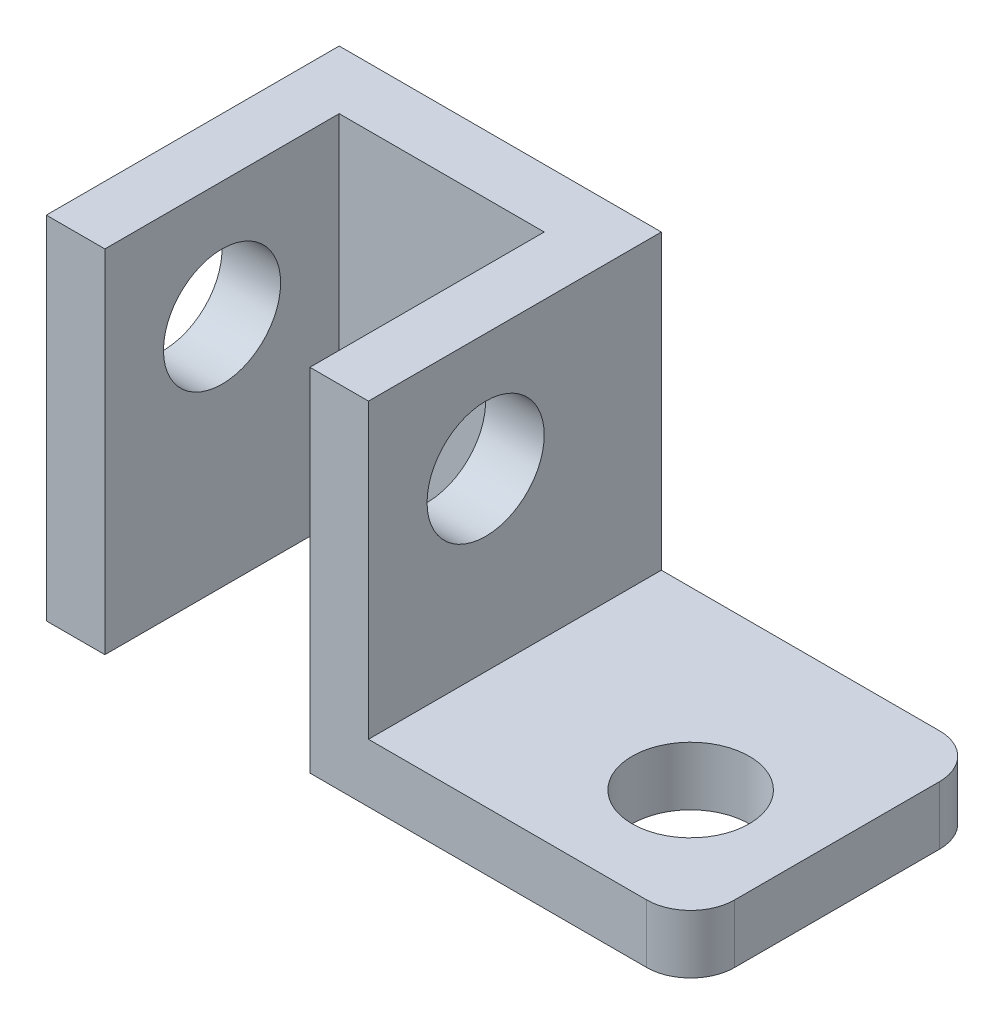
ISO-10303-21;
HEADER;
FILE_DESCRIPTION(('STEP AP214'),'2;1');
FILE_NAME('part.step','',(''),(''),'','','');
FILE_SCHEMA(('AUTOMOTIVE_DESIGN { 1 0 10303 214 1 1 1 1 }'));
ENDSEC;
DATA;
#1=APPLICATION_CONTEXT('core data for automotive mechanical design processes');
#2=APPLICATION_PROTOCOL_DEFINITION('international standard','automotive_design',2000,#1);
#3=PRODUCT_CONTEXT('',#1,'mechanical');
#4=PRODUCT('Part','Part','',(#3));
#5=PRODUCT_RELATED_PRODUCT_CATEGORY('part','',(#4));
#6=PRODUCT_DEFINITION_FORMATION('','',#4);
#7=PRODUCT_DEFINITION_CONTEXT('part definition',#1,'design');
#8=PRODUCT_DEFINITION('design','',#6,#7);
#9=PRODUCT_DEFINITION_SHAPE('','',#8);
#10=(LENGTH_UNIT() NAMED_UNIT(*) SI_UNIT(.MILLI.,.METRE.));
#11=(NAMED_UNIT(*) PLANE_ANGLE_UNIT() SI_UNIT($,.RADIAN.));
#12=(NAMED_UNIT(*) SI_UNIT($,.STERADIAN.) SOLID_ANGLE_UNIT());
#13=UNCERTAINTY_MEASURE_WITH_UNIT(LENGTH_MEASURE(1.E-05),#10,'distance_accuracy_value','');
#14=(GEOMETRIC_REPRESENTATION_CONTEXT(3) GLOBAL_UNCERTAINTY_ASSIGNED_CONTEXT((#13)) GLOBAL_UNIT_ASSIGNED_CONTEXT((#10,
#11,#12)) REPRESENTATION_CONTEXT('',''));
#15=CARTESIAN_POINT('',(0.,0.,0.));
#16=DIRECTION('',(0.,0.,1.));
#17=DIRECTION('',(1.,0.,0.));
#18=AXIS2_PLACEMENT_3D('',#15,#16,#17);
#19=CARTESIAN_POINT('',(0.,120.,-80.));
#20=DIRECTION('',(1.,0.,0.));
#21=DIRECTION('',(0.,0.,-1.));
#22=AXIS2_PLACEMENT_3D('',#19,#20,#21);
#23=PLANE('',#22);
#24=CARTESIAN_POINT('',(0.,80.,-40.));
#25=DIRECTION('',(1.,0.,0.));
#26=DIRECTION('',(0.,0.,-1.));
#27=AXIS2_PLACEMENT_3D('',#24,#25,#26);
#28=CIRCLE('',#27,20.);
#29=CARTESIAN_POINT('',(0.,80.,-60.));
#30=VERTEX_POINT('',#29);
#31=EDGE_CURVE('E303',#30,#30,#28,.T.);
#32=ORIENTED_EDGE('',*,*,#31,.F.);
#33=EDGE_LOOP('',(#32));
#34=FACE_BOUND('',#33,.T.);
#35=DIRECTION('',(0.,-1.,0.));
#36=VECTOR('',#35,1.);
#37=CARTESIAN_POINT('',(0.,120.,0.));
#38=LINE('',#37,#36);
#39=CARTESIAN_POINT('',(0.,120.,0.));
#40=VERTEX_POINT('',#39);
#41=CARTESIAN_POINT('',(0.,0.,0.));
#42=VERTEX_POINT('',#41);
#43=EDGE_CURVE('E253',#40,#42,#38,.T.);
#44=ORIENTED_EDGE('',*,*,#43,.T.);
#45=DIRECTION('',(0.,0.,1.));
#46=VECTOR('',#45,1.);
#47=CARTESIAN_POINT('',(0.,0.,-80.));
#48=LINE('',#47,#46);
#49=CARTESIAN_POINT('',(0.,0.,-80.));
#50=VERTEX_POINT('',#49);
#51=EDGE_CURVE('E237',#50,#42,#48,.T.);
#52=ORIENTED_EDGE('',*,*,#51,.F.);
#53=DIRECTION('',(0.,-1.,0.));
#54=VECTOR('',#53,1.);
#55=CARTESIAN_POINT('',(0.,120.,-80.));
#56=LINE('',#55,#54);
#57=CARTESIAN_POINT('',(0.,120.,-80.));
#58=VERTEX_POINT('',#57);
#59=EDGE_CURVE('E12',#58,#50,#56,.T.);
#60=ORIENTED_EDGE('',*,*,#59,.F.);
#61=DIRECTION('',(0.,0.,1.));
#62=VECTOR('',#61,1.);
#63=CARTESIAN_POINT('',(0.,120.,-80.));
#64=LINE('',#63,#62);
#65=EDGE_CURVE('E255',#58,#40,#64,.T.);
#66=ORIENTED_EDGE('',*,*,#65,.T.);
#67=EDGE_LOOP('',(#44,#52,#60,#66));
#68=FACE_BOUND('',#67,.T.);
#69=ADVANCED_FACE('F173',(#34,#68),#23,.T.);
#70=CARTESIAN_POINT('',(0.,0.,0.));
#71=DIRECTION('',(0.,-1.,0.));
#72=DIRECTION('',(-1.,0.,0.));
#73=AXIS2_PLACEMENT_3D('',#70,#71,#72);
#74=PLANE('',#73);
#75=DIRECTION('',(1.,0.,0.));
#76=VECTOR('',#75,1.);
#77=CARTESIAN_POINT('',(-20.,0.,-100.));
#78=LINE('',#77,#76);
#79=CARTESIAN_POINT('',(-20.,0.,-100.));
#80=VERTEX_POINT('',#79);
#81=CARTESIAN_POINT('',(185.,0.,-100.));
#82=VERTEX_POINT('',#81);
#83=EDGE_CURVE('E270',#80,#82,#78,.T.);
#84=ORIENTED_EDGE('',*,*,#83,.T.);
#85=CARTESIAN_POINT('',(185.,0.,-85.));
#86=DIRECTION('',(0.,1.,0.));
#87=DIRECTION('',(0.,0.,1.));
#88=AXIS2_PLACEMENT_3D('',#85,#86,#87);
#89=CIRCLE('',#88,15.);
#90=CARTESIAN_POINT('',(200.,0.,-85.));
#91=VERTEX_POINT('',#90);
#92=EDGE_CURVE('E309',#91,#82,#89,.T.);
#93=ORIENTED_EDGE('',*,*,#92,.F.);
#94=DIRECTION('',(0.,0.,-1.));
#95=VECTOR('',#94,1.);
#96=CARTESIAN_POINT('',(200.,0.,0.));
#97=LINE('',#96,#95);
#98=CARTESIAN_POINT('',(200.,0.,-15.));
#99=VERTEX_POINT('',#98);
#100=EDGE_CURVE('E306',#99,#91,#97,.T.);
#101=ORIENTED_EDGE('',*,*,#100,.F.);
#102=CARTESIAN_POINT('',(185.,0.,-15.));
#103=DIRECTION('',(0.,1.,0.));
#104=DIRECTION('',(0.,0.,1.));
#105=AXIS2_PLACEMENT_3D('',#102,#103,#104);
#106=CIRCLE('',#105,15.);
#107=CARTESIAN_POINT('',(185.,0.,0.));
#108=VERTEX_POINT('',#107);
#109=EDGE_CURVE('E302',#108,#99,#106,.T.);
#110=ORIENTED_EDGE('',*,*,#109,.F.);
#111=DIRECTION('',(-1.,0.,0.));
#112=VECTOR('',#111,1.);
#113=CARTESIAN_POINT('',(90.,0.,0.));
#114=LINE('',#113,#112);
#115=CARTESIAN_POINT('',(70.,0.,0.));
#116=VERTEX_POINT('',#115);
#117=EDGE_CURVE('E325',#108,#116,#114,.T.);
#118=ORIENTED_EDGE('',*,*,#117,.T.);
#119=DIRECTION('',(0.,0.,-1.));
#120=VECTOR('',#119,1.);
#121=CARTESIAN_POINT('',(70.,0.,0.));
#122=LINE('',#121,#120);
#123=CARTESIAN_POINT('',(70.,0.,-80.));
#124=VERTEX_POINT('',#123);
#125=EDGE_CURVE('E336',#116,#124,#122,.T.);
#126=ORIENTED_EDGE('',*,*,#125,.T.);
#127=DIRECTION('',(-1.,0.,0.));
#128=VECTOR('',#127,1.);
#129=CARTESIAN_POINT('',(70.,0.,-80.));
#130=LINE('',#129,#128);
#131=EDGE_CURVE('E247',#124,#50,#130,.T.);
#132=ORIENTED_EDGE('',*,*,#131,.T.);
#133=ORIENTED_EDGE('',*,*,#51,.T.);
#134=DIRECTION('',(-1.,0.,0.));
#135=VECTOR('',#134,1.);
#136=CARTESIAN_POINT('',(0.,0.,0.));
#137=LINE('',#136,#135);
#138=CARTESIAN_POINT('',(-20.,0.,0.));
#139=VERTEX_POINT('',#138);
#140=EDGE_CURVE('E244',#42,#139,#137,.T.);
#141=ORIENTED_EDGE('',*,*,#140,.T.);
#142=DIRECTION('',(0.,0.,-1.));
#143=VECTOR('',#142,1.);
#144=CARTESIAN_POINT('',(-20.,0.,0.));
#145=LINE('',#144,#143);
#146=EDGE_CURVE('E265',#139,#80,#145,.T.);
#147=ORIENTED_EDGE('',*,*,#146,.T.);
#148=EDGE_LOOP('',(#84,#93,#101,#110,#118,#126,#132,#133,#141,#147));
#149=FACE_BOUND('',#148,.T.);
#150=CARTESIAN_POINT('',(160.,0.,-40.));
#151=DIRECTION('',(0.,1.,0.));
#152=DIRECTION('',(0.,0.,1.));
#153=AXIS2_PLACEMENT_3D('',#150,#151,#152);
#154=CIRCLE('',#153,20.);
#155=CARTESIAN_POINT('',(160.,0.,-20.));
#156=VERTEX_POINT('',#155);
#157=EDGE_CURVE('E299',#156,#156,#154,.T.);
#158=ORIENTED_EDGE('',*,*,#157,.T.);
#159=EDGE_LOOP('',(#158));
#160=FACE_BOUND('',#159,.T.);
#161=ADVANCED_FACE('F240',(#149,#160),#74,.T.);
#162=CARTESIAN_POINT('',(90.,120.,-10.));
#163=DIRECTION('',(1.,0.,0.));
#164=DIRECTION('',(0.,0.,-1.));
#165=AXIS2_PLACEMENT_3D('',#162,#163,#164);
#166=PLANE('',#165);
#167=CARTESIAN_POINT('',(90.,80.,-40.));
#168=DIRECTION('',(1.,0.,0.));
#169=DIRECTION('',(0.,0.,-1.));
#170=AXIS2_PLACEMENT_3D('',#167,#168,#169);
#171=CIRCLE('',#170,20.);
#172=CARTESIAN_POINT('',(90.,80.,-60.));
#173=VERTEX_POINT('',#172);
#174=EDGE_CURVE('E427',#173,#173,#171,.T.);
#175=ORIENTED_EDGE('',*,*,#174,.F.);
#176=EDGE_LOOP('',(#175));
#177=FACE_BOUND('',#176,.T.);
#178=DIRECTION('',(0.,0.,1.));
#179=VECTOR('',#178,1.);
#180=CARTESIAN_POINT('',(90.,20.,0.));
#181=LINE('',#180,#179);
#182=CARTESIAN_POINT('',(90.,20.,-100.));
#183=VERTEX_POINT('',#182);
#184=CARTESIAN_POINT('',(90.,20.,0.));
#185=VERTEX_POINT('',#184);
#186=EDGE_CURVE('E190',#183,#185,#181,.T.);
#187=ORIENTED_EDGE('',*,*,#186,.F.);
#188=DIRECTION('',(0.,-1.,0.));
#189=VECTOR('',#188,1.);
#190=CARTESIAN_POINT('',(90.,120.,-100.));
#191=LINE('',#190,#189);
#192=CARTESIAN_POINT('',(90.,120.,-100.));
#193=VERTEX_POINT('',#192);
#194=EDGE_CURVE('E250',#193,#183,#191,.T.);
#195=ORIENTED_EDGE('',*,*,#194,.F.);
#196=DIRECTION('',(0.,0.,1.));
#197=VECTOR('',#196,1.);
#198=CARTESIAN_POINT('',(90.,120.,-10.));
#199=LINE('',#198,#197);
#200=CARTESIAN_POINT('',(90.,120.,0.));
#201=VERTEX_POINT('',#200);
#202=EDGE_CURVE('E333',#193,#201,#199,.T.);
#203=ORIENTED_EDGE('',*,*,#202,.T.);
#204=DIRECTION('',(0.,-1.,0.));
#205=VECTOR('',#204,1.);
#206=CARTESIAN_POINT('',(90.,120.,0.));
#207=LINE('',#206,#205);
#208=EDGE_CURVE('E198',#201,#185,#207,.T.);
#209=ORIENTED_EDGE('',*,*,#208,.T.);
#210=EDGE_LOOP('',(#187,#195,#203,#209));
#211=FACE_BOUND('',#210,.T.);
#212=ADVANCED_FACE('F388',(#177,#211),#166,.T.);
#213=CARTESIAN_POINT('',(0.,120.,0.));
#214=DIRECTION('',(0.,-1.,0.));
#215=DIRECTION('',(-1.,0.,0.));
#216=AXIS2_PLACEMENT_3D('',#213,#214,#215);
#217=PLANE('',#216);
#218=ORIENTED_EDGE('',*,*,#202,.F.);
#219=DIRECTION('',(1.,0.,0.));
#220=VECTOR('',#219,1.);
#221=CARTESIAN_POINT('',(-20.,120.,-100.));
#222=LINE('',#221,#220);
#223=CARTESIAN_POINT('',(-20.,120.,-100.));
#224=VERTEX_POINT('',#223);
#225=EDGE_CURVE('E264',#224,#193,#222,.T.);
#226=ORIENTED_EDGE('',*,*,#225,.F.);
#227=DIRECTION('',(0.,0.,-1.));
#228=VECTOR('',#227,1.);
#229=CARTESIAN_POINT('',(-20.,120.,0.));
#230=LINE('',#229,#228);
#231=CARTESIAN_POINT('',(-20.,120.,0.));
#232=VERTEX_POINT('',#231);
#233=EDGE_CURVE('E268',#232,#224,#230,.T.);
#234=ORIENTED_EDGE('',*,*,#233,.F.);
#235=DIRECTION('',(-1.,0.,0.));
#236=VECTOR('',#235,1.);
#237=CARTESIAN_POINT('',(0.,120.,0.));
#238=LINE('',#237,#236);
#239=EDGE_CURVE('E260',#40,#232,#238,.T.);
#240=ORIENTED_EDGE('',*,*,#239,.F.);
#241=ORIENTED_EDGE('',*,*,#65,.F.);
#242=DIRECTION('',(-1.,0.,0.));
#243=VECTOR('',#242,1.);
#244=CARTESIAN_POINT('',(70.,120.,-80.));
#245=LINE('',#244,#243);
#246=CARTESIAN_POINT('',(70.,120.,-80.));
#247=VERTEX_POINT('',#246);
#248=EDGE_CURVE('E324',#247,#58,#245,.T.);
#249=ORIENTED_EDGE('',*,*,#248,.F.);
#250=DIRECTION('',(0.,0.,-1.));
#251=VECTOR('',#250,1.);
#252=CARTESIAN_POINT('',(70.,120.,0.));
#253=LINE('',#252,#251);
#254=CARTESIAN_POINT('',(70.,120.,0.));
#255=VERTEX_POINT('',#254);
#256=EDGE_CURVE('E328',#255,#247,#253,.T.);
#257=ORIENTED_EDGE('',*,*,#256,.F.);
#258=DIRECTION('',(-1.,0.,0.));
#259=VECTOR('',#258,1.);
#260=CARTESIAN_POINT('',(90.,120.,0.));
#261=LINE('',#260,#259);
#262=EDGE_CURVE('E331',#201,#255,#261,.T.);
#263=ORIENTED_EDGE('',*,*,#262,.F.);
#264=EDGE_LOOP('',(#218,#226,#234,#240,#241,#249,#257,#263));
#265=FACE_BOUND('',#264,.T.);
#266=ADVANCED_FACE('F382',(#265),#217,.F.);
#267=CARTESIAN_POINT('',(70.,120.,-80.));
#268=DIRECTION('',(0.,0.,1.));
#269=DIRECTION('',(1.,0.,0.));
#270=AXIS2_PLACEMENT_3D('',#267,#268,#269);
#271=PLANE('',#270);
#272=ORIENTED_EDGE('',*,*,#131,.F.);
#273=DIRECTION('',(0.,-1.,0.));
#274=VECTOR('',#273,1.);
#275=CARTESIAN_POINT('',(70.,120.,-80.));
#276=LINE('',#275,#274);
#277=EDGE_CURVE('E182',#247,#124,#276,.T.);
#278=ORIENTED_EDGE('',*,*,#277,.F.);
#279=ORIENTED_EDGE('',*,*,#248,.T.);
#280=ORIENTED_EDGE('',*,*,#59,.T.);
#281=EDGE_LOOP('',(#272,#278,#279,#280));
#282=FACE_BOUND('',#281,.T.);
#283=ADVANCED_FACE('F377',(#282),#271,.T.);
#284=CARTESIAN_POINT('',(70.,120.,0.));
#285=DIRECTION('',(-1.,0.,0.));
#286=DIRECTION('',(0.,0.,1.));
#287=AXIS2_PLACEMENT_3D('',#284,#285,#286);
#288=PLANE('',#287);
#289=CARTESIAN_POINT('',(70.,80.,-40.));
#290=DIRECTION('',(-1.,0.,0.));
#291=DIRECTION('',(0.,0.,1.));
#292=AXIS2_PLACEMENT_3D('',#289,#290,#291);
#293=CIRCLE('',#292,20.);
#294=CARTESIAN_POINT('',(70.,80.,-20.));
#295=VERTEX_POINT('',#294);
#296=EDGE_CURVE('E425',#295,#295,#293,.T.);
#297=ORIENTED_EDGE('',*,*,#296,.F.);
#298=EDGE_LOOP('',(#297));
#299=FACE_BOUND('',#298,.T.);
#300=ORIENTED_EDGE('',*,*,#125,.F.);
#301=DIRECTION('',(0.,-1.,0.));
#302=VECTOR('',#301,1.);
#303=CARTESIAN_POINT('',(70.,120.,0.));
#304=LINE('',#303,#302);
#305=EDGE_CURVE('E340',#255,#116,#304,.T.);
#306=ORIENTED_EDGE('',*,*,#305,.F.);
#307=ORIENTED_EDGE('',*,*,#256,.T.);
#308=ORIENTED_EDGE('',*,*,#277,.T.);
#309=EDGE_LOOP('',(#300,#306,#307,#308));
#310=FACE_BOUND('',#309,.T.);
#311=ADVANCED_FACE('F384',(#299,#310),#288,.T.);
#312=CARTESIAN_POINT('',(90.,120.,0.));
#313=DIRECTION('',(0.,0.,1.));
#314=DIRECTION('',(1.,0.,0.));
#315=AXIS2_PLACEMENT_3D('',#312,#313,#314);
#316=PLANE('',#315);
#317=ORIENTED_EDGE('',*,*,#305,.T.);
#318=ORIENTED_EDGE('',*,*,#117,.F.);
#319=DIRECTION('',(0.,-1.,0.));
#320=VECTOR('',#319,1.);
#321=CARTESIAN_POINT('',(185.,20.,0.));
#322=LINE('',#321,#320);
#323=CARTESIAN_POINT('',(185.,20.,0.));
#324=VERTEX_POINT('',#323);
#325=EDGE_CURVE('E320',#324,#108,#322,.T.);
#326=ORIENTED_EDGE('',*,*,#325,.F.);
#327=DIRECTION('',(1.,0.,0.));
#328=VECTOR('',#327,1.);
#329=CARTESIAN_POINT('',(0.,20.,0.));
#330=LINE('',#329,#328);
#331=EDGE_CURVE('E438',#185,#324,#330,.T.);
#332=ORIENTED_EDGE('',*,*,#331,.F.);
#333=ORIENTED_EDGE('',*,*,#208,.F.);
#334=ORIENTED_EDGE('',*,*,#262,.T.);
#335=EDGE_LOOP('',(#317,#318,#326,#332,#333,#334));
#336=FACE_BOUND('',#335,.T.);
#337=ADVANCED_FACE('F385',(#336),#316,.T.);
#338=CARTESIAN_POINT('',(-20.,120.,-100.));
#339=DIRECTION('',(0.,0.,-1.));
#340=DIRECTION('',(-1.,0.,0.));
#341=AXIS2_PLACEMENT_3D('',#338,#339,#340);
#342=PLANE('',#341);
#343=ORIENTED_EDGE('',*,*,#194,.T.);
#344=DIRECTION('',(-1.,0.,0.));
#345=VECTOR('',#344,1.);
#346=CARTESIAN_POINT('',(0.,20.,-100.));
#347=LINE('',#346,#345);
#348=CARTESIAN_POINT('',(185.,20.,-100.));
#349=VERTEX_POINT('',#348);
#350=EDGE_CURVE('E281',#349,#183,#347,.T.);
#351=ORIENTED_EDGE('',*,*,#350,.F.);
#352=DIRECTION('',(0.,-1.,0.));
#353=VECTOR('',#352,1.);
#354=CARTESIAN_POINT('',(185.,20.,-100.));
#355=LINE('',#354,#353);
#356=EDGE_CURVE('E293',#349,#82,#355,.T.);
#357=ORIENTED_EDGE('',*,*,#356,.T.);
#358=ORIENTED_EDGE('',*,*,#83,.F.);
#359=DIRECTION('',(0.,-1.,0.));
#360=VECTOR('',#359,1.);
#361=CARTESIAN_POINT('',(-20.,120.,-100.));
#362=LINE('',#361,#360);
#363=EDGE_CURVE('E275',#224,#80,#362,.T.);
#364=ORIENTED_EDGE('',*,*,#363,.F.);
#365=ORIENTED_EDGE('',*,*,#225,.T.);
#366=EDGE_LOOP('',(#343,#351,#357,#358,#364,#365));
#367=FACE_BOUND('',#366,.T.);
#368=ADVANCED_FACE('F175',(#367),#342,.T.);
#369=CARTESIAN_POINT('',(-20.,120.,0.));
#370=DIRECTION('',(-1.,0.,0.));
#371=DIRECTION('',(0.,0.,1.));
#372=AXIS2_PLACEMENT_3D('',#369,#370,#371);
#373=PLANE('',#372);
#374=CARTESIAN_POINT('',(-20.,80.,-40.));
#375=DIRECTION('',(-1.,0.,0.));
#376=DIRECTION('',(0.,0.,1.));
#377=AXIS2_PLACEMENT_3D('',#374,#375,#376);
#378=CIRCLE('',#377,20.);
#379=CARTESIAN_POINT('',(-20.,80.,-20.));
#380=VERTEX_POINT('',#379);
#381=EDGE_CURVE('E177',#380,#380,#378,.T.);
#382=ORIENTED_EDGE('',*,*,#381,.F.);
#383=EDGE_LOOP('',(#382));
#384=FACE_BOUND('',#383,.T.);
#385=ORIENTED_EDGE('',*,*,#146,.F.);
#386=DIRECTION('',(0.,-1.,0.));
#387=VECTOR('',#386,1.);
#388=CARTESIAN_POINT('',(-20.,120.,0.));
#389=LINE('',#388,#387);
#390=EDGE_CURVE('E259',#232,#139,#389,.T.);
#391=ORIENTED_EDGE('',*,*,#390,.F.);
#392=ORIENTED_EDGE('',*,*,#233,.T.);
#393=ORIENTED_EDGE('',*,*,#363,.T.);
#394=EDGE_LOOP('',(#385,#391,#392,#393));
#395=FACE_BOUND('',#394,.T.);
#396=ADVANCED_FACE('F406',(#384,#395),#373,.T.);
#397=CARTESIAN_POINT('',(0.,120.,0.));
#398=DIRECTION('',(0.,0.,1.));
#399=DIRECTION('',(1.,0.,0.));
#400=AXIS2_PLACEMENT_3D('',#397,#398,#399);
#401=PLANE('',#400);
#402=ORIENTED_EDGE('',*,*,#140,.F.);
#403=ORIENTED_EDGE('',*,*,#43,.F.);
#404=ORIENTED_EDGE('',*,*,#239,.T.);
#405=ORIENTED_EDGE('',*,*,#390,.T.);
#406=EDGE_LOOP('',(#402,#403,#404,#405));
#407=FACE_BOUND('',#406,.T.);
#408=ADVANCED_FACE('F262',(#407),#401,.T.);
#409=CARTESIAN_POINT('',(185.,20.,-15.));
#410=DIRECTION('',(0.,-1.,0.));
#411=DIRECTION('',(0.,0.,-1.));
#412=AXIS2_PLACEMENT_3D('',#409,#410,#411);
#413=CYLINDRICAL_SURFACE('',#412,15.);
#414=ORIENTED_EDGE('',*,*,#109,.T.);
#415=DIRECTION('',(0.,-1.,0.));
#416=VECTOR('',#415,1.);
#417=CARTESIAN_POINT('',(200.,20.,-15.));
#418=LINE('',#417,#416);
#419=CARTESIAN_POINT('',(200.,20.,-15.));
#420=VERTEX_POINT('',#419);
#421=EDGE_CURVE('E317',#420,#99,#418,.T.);
#422=ORIENTED_EDGE('',*,*,#421,.F.);
#423=CARTESIAN_POINT('',(185.,20.,-15.));
#424=DIRECTION('',(0.,1.,0.));
#425=DIRECTION('',(0.,0.,1.));
#426=AXIS2_PLACEMENT_3D('',#423,#424,#425);
#427=CIRCLE('',#426,15.);
#428=EDGE_CURVE('E440',#324,#420,#427,.T.);
#429=ORIENTED_EDGE('',*,*,#428,.F.);
#430=ORIENTED_EDGE('',*,*,#325,.T.);
#431=EDGE_LOOP('',(#414,#422,#429,#430));
#432=FACE_BOUND('',#431,.T.);
#433=ADVANCED_FACE('F398',(#432),#413,.T.);
#434=CARTESIAN_POINT('',(200.,20.,0.));
#435=DIRECTION('',(-1.,0.,0.));
#436=DIRECTION('',(0.,0.,1.));
#437=AXIS2_PLACEMENT_3D('',#434,#435,#436);
#438=PLANE('',#437);
#439=ORIENTED_EDGE('',*,*,#100,.T.);
#440=DIRECTION('',(0.,-1.,0.));
#441=VECTOR('',#440,1.);
#442=CARTESIAN_POINT('',(200.,20.,-85.));
#443=LINE('',#442,#441);
#444=CARTESIAN_POINT('',(200.,20.,-85.));
#445=VERTEX_POINT('',#444);
#446=EDGE_CURVE('E314',#445,#91,#443,.T.);
#447=ORIENTED_EDGE('',*,*,#446,.F.);
#448=DIRECTION('',(0.,0.,-1.));
#449=VECTOR('',#448,1.);
#450=CARTESIAN_POINT('',(200.,20.,0.));
#451=LINE('',#450,#449);
#452=EDGE_CURVE('E295',#420,#445,#451,.T.);
#453=ORIENTED_EDGE('',*,*,#452,.F.);
#454=ORIENTED_EDGE('',*,*,#421,.T.);
#455=EDGE_LOOP('',(#439,#447,#453,#454));
#456=FACE_BOUND('',#455,.T.);
#457=ADVANCED_FACE('F361',(#456),#438,.F.);
#458=CARTESIAN_POINT('',(185.,20.,-85.));
#459=DIRECTION('',(0.,-1.,0.));
#460=DIRECTION('',(0.,0.,-1.));
#461=AXIS2_PLACEMENT_3D('',#458,#459,#460);
#462=CYLINDRICAL_SURFACE('',#461,15.);
#463=ORIENTED_EDGE('',*,*,#92,.T.);
#464=ORIENTED_EDGE('',*,*,#356,.F.);
#465=CARTESIAN_POINT('',(185.,20.,-85.));
#466=DIRECTION('',(0.,1.,0.));
#467=DIRECTION('',(0.,0.,1.));
#468=AXIS2_PLACEMENT_3D('',#465,#466,#467);
#469=CIRCLE('',#468,15.);
#470=EDGE_CURVE('E290',#445,#349,#469,.T.);
#471=ORIENTED_EDGE('',*,*,#470,.F.);
#472=ORIENTED_EDGE('',*,*,#446,.T.);
#473=EDGE_LOOP('',(#463,#464,#471,#472));
#474=FACE_BOUND('',#473,.T.);
#475=ADVANCED_FACE('F354',(#474),#462,.T.);
#476=CARTESIAN_POINT('',(160.,20.,-40.));
#477=DIRECTION('',(0.,-1.,0.));
#478=DIRECTION('',(0.,0.,-1.));
#479=AXIS2_PLACEMENT_3D('',#476,#477,#478);
#480=CYLINDRICAL_SURFACE('',#479,20.);
#481=CARTESIAN_POINT('',(160.,20.,-40.));
#482=DIRECTION('',(0.,1.,0.));
#483=DIRECTION('',(0.,0.,1.));
#484=AXIS2_PLACEMENT_3D('',#481,#482,#483);
#485=CIRCLE('',#484,20.);
#486=CARTESIAN_POINT('',(160.,20.,-20.));
#487=VERTEX_POINT('',#486);
#488=EDGE_CURVE('E312',#487,#487,#485,.T.);
#489=ORIENTED_EDGE('',*,*,#488,.T.);
#490=EDGE_LOOP('',(#489));
#491=FACE_BOUND('',#490,.T.);
#492=ORIENTED_EDGE('',*,*,#157,.F.);
#493=EDGE_LOOP('',(#492));
#494=FACE_BOUND('',#493,.T.);
#495=ADVANCED_FACE('F452',(#491,#494),#480,.F.);
#496=CARTESIAN_POINT('',(0.,20.,0.));
#497=DIRECTION('',(0.,1.,0.));
#498=DIRECTION('',(0.,0.,1.));
#499=AXIS2_PLACEMENT_3D('',#496,#497,#498);
#500=PLANE('',#499);
#501=ORIENTED_EDGE('',*,*,#488,.F.);
#502=EDGE_LOOP('',(#501));
#503=FACE_BOUND('',#502,.T.);
#504=ORIENTED_EDGE('',*,*,#331,.T.);
#505=ORIENTED_EDGE('',*,*,#428,.T.);
#506=ORIENTED_EDGE('',*,*,#452,.T.);
#507=ORIENTED_EDGE('',*,*,#470,.T.);
#508=ORIENTED_EDGE('',*,*,#350,.T.);
#509=ORIENTED_EDGE('',*,*,#186,.T.);
#510=EDGE_LOOP('',(#504,#505,#506,#507,#508,#509));
#511=FACE_BOUND('',#510,.T.);
#512=ADVANCED_FACE('F287',(#503,#511),#500,.T.);
#513=CARTESIAN_POINT('',(200.,80.,-40.));
#514=DIRECTION('',(-1.,0.,0.));
#515=DIRECTION('',(0.,0.,1.));
#516=AXIS2_PLACEMENT_3D('',#513,#514,#515);
#517=CYLINDRICAL_SURFACE('',#516,20.);
#518=ORIENTED_EDGE('',*,*,#31,.T.);
#519=EDGE_LOOP('',(#518));
#520=FACE_BOUND('',#519,.T.);
#521=ORIENTED_EDGE('',*,*,#381,.T.);
#522=EDGE_LOOP('',(#521));
#523=FACE_BOUND('',#522,.T.);
#524=ADVANCED_FACE('F459',(#520,#523),#517,.F.);
#525=ORIENTED_EDGE('',*,*,#174,.T.);
#526=EDGE_LOOP('',(#525));
#527=FACE_BOUND('',#526,.T.);
#528=ORIENTED_EDGE('',*,*,#296,.T.);
#529=EDGE_LOOP('',(#528));
#530=FACE_BOUND('',#529,.T.);
#531=ADVANCED_FACE('F468',(#527,#530),#517,.F.);
#532=CLOSED_SHELL('',(#69,#161,#212,#266,#283,#311,#337,#368,#396,#408,#433,#457,#475,#495,#512,
#524,#531));
#533=MANIFOLD_SOLID_BREP('B2',#532);
#534=ADVANCED_BREP_SHAPE_REPRESENTATION('',(#18,#533),#14);
#535=SHAPE_DEFINITION_REPRESENTATION(#9,#534);
ENDSEC;
END-ISO-10303-21;
